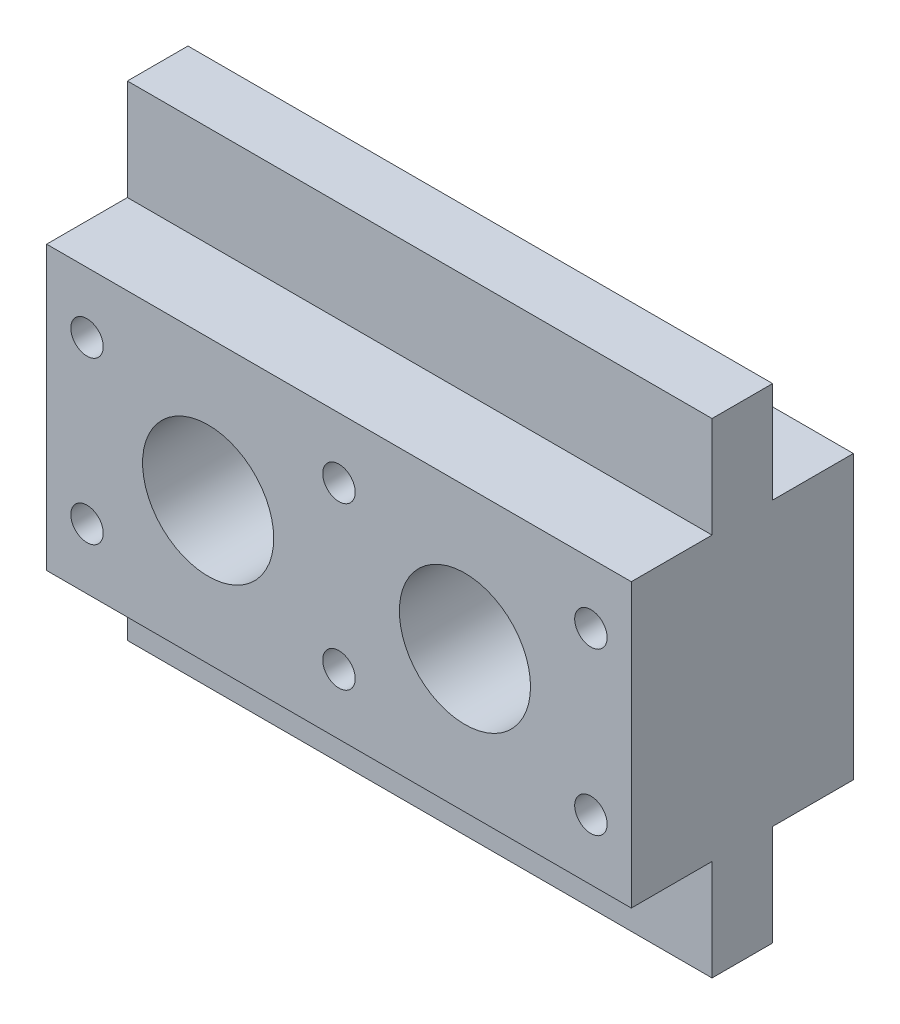
ISO-10303-21;
HEADER;
FILE_DESCRIPTION(('STEP AP214'),'2;1');
FILE_NAME('part.step','',(''),(''),'','','');
FILE_SCHEMA(('AUTOMOTIVE_DESIGN { 1 0 10303 214 1 1 1 1 }'));
ENDSEC;
DATA;
#1=APPLICATION_CONTEXT('core data for automotive mechanical design processes');
#2=APPLICATION_PROTOCOL_DEFINITION('international standard','automotive_design',2000,#1);
#3=PRODUCT_CONTEXT('',#1,'mechanical');
#4=PRODUCT('Part','Part','',(#3));
#5=PRODUCT_RELATED_PRODUCT_CATEGORY('part','',(#4));
#6=PRODUCT_DEFINITION_FORMATION('','',#4);
#7=PRODUCT_DEFINITION_CONTEXT('part definition',#1,'design');
#8=PRODUCT_DEFINITION('design','',#6,#7);
#9=PRODUCT_DEFINITION_SHAPE('','',#8);
#10=(LENGTH_UNIT() NAMED_UNIT(*) SI_UNIT(.MILLI.,.METRE.));
#11=(NAMED_UNIT(*) PLANE_ANGLE_UNIT() SI_UNIT($,.RADIAN.));
#12=(NAMED_UNIT(*) SI_UNIT($,.STERADIAN.) SOLID_ANGLE_UNIT());
#13=UNCERTAINTY_MEASURE_WITH_UNIT(LENGTH_MEASURE(1.E-05),#10,'distance_accuracy_value','');
#14=(GEOMETRIC_REPRESENTATION_CONTEXT(3) GLOBAL_UNCERTAINTY_ASSIGNED_CONTEXT((#13)) GLOBAL_UNIT_ASSIGNED_CONTEXT((#10,
#11,#12)) REPRESENTATION_CONTEXT('',''));
#15=CARTESIAN_POINT('',(0.,0.,0.));
#16=DIRECTION('',(0.,0.,1.));
#17=DIRECTION('',(1.,0.,0.));
#18=AXIS2_PLACEMENT_3D('',#15,#16,#17);
#19=CARTESIAN_POINT('',(0.,0.,4.7625));
#20=DIRECTION('',(0.,0.,-1.));
#21=DIRECTION('',(-1.,0.,0.));
#22=AXIS2_PLACEMENT_3D('',#19,#20,#21);
#23=PLANE('',#22);
#24=DIRECTION('',(0.,1.,0.));
#25=VECTOR('',#24,1.);
#26=CARTESIAN_POINT('',(91.948,0.,4.7625));
#27=LINE('',#26,#25);
#28=CARTESIAN_POINT('',(91.948,0.,4.7625));
#29=VERTEX_POINT('',#28);
#30=CARTESIAN_POINT('',(91.948,15.875,4.7625));
#31=VERTEX_POINT('',#30);
#32=EDGE_CURVE('E219',#29,#31,#27,.T.);
#33=ORIENTED_EDGE('',*,*,#32,.T.);
#34=DIRECTION('',(-1.,0.,0.));
#35=VECTOR('',#34,1.);
#36=CARTESIAN_POINT('',(0.,15.875,4.7625));
#37=LINE('',#36,#35);
#38=CARTESIAN_POINT('',(0.,15.875,4.7625));
#39=VERTEX_POINT('',#38);
#40=EDGE_CURVE('E190',#31,#39,#37,.T.);
#41=ORIENTED_EDGE('',*,*,#40,.T.);
#42=DIRECTION('',(0.,-1.,0.));
#43=VECTOR('',#42,1.);
#44=CARTESIAN_POINT('',(0.,0.,4.7625));
#45=LINE('',#44,#43);
#46=CARTESIAN_POINT('',(0.,0.,4.7625));
#47=VERTEX_POINT('',#46);
#48=EDGE_CURVE('E209',#39,#47,#45,.T.);
#49=ORIENTED_EDGE('',*,*,#48,.T.);
#50=DIRECTION('',(1.,0.,0.));
#51=VECTOR('',#50,1.);
#52=CARTESIAN_POINT('',(0.,0.,4.7625));
#53=LINE('',#52,#51);
#54=EDGE_CURVE('E216',#47,#29,#53,.T.);
#55=ORIENTED_EDGE('',*,*,#54,.T.);
#56=EDGE_LOOP('',(#33,#41,#49,#55));
#57=FACE_BOUND('',#56,.T.);
#58=ADVANCED_FACE('F48',(#57),#23,.F.);
#59=CARTESIAN_POINT('',(0.,0.,4.7625));
#60=DIRECTION('',(1.,0.,0.));
#61=DIRECTION('',(0.,0.,-1.));
#62=AXIS2_PLACEMENT_3D('',#59,#60,#61);
#63=PLANE('',#62);
#64=DIRECTION('',(0.,0.,-1.));
#65=VECTOR('',#64,1.);
#66=CARTESIAN_POINT('',(0.,76.2,4.7625));
#67=LINE('',#66,#65);
#68=CARTESIAN_POINT('',(0.,76.2,4.7625));
#69=VERTEX_POINT('',#68);
#70=CARTESIAN_POINT('',(0.,76.2,-4.7625));
#71=VERTEX_POINT('',#70);
#72=EDGE_CURVE('E223',#69,#71,#67,.T.);
#73=ORIENTED_EDGE('',*,*,#72,.T.);
#74=DIRECTION('',(0.,-1.,0.));
#75=VECTOR('',#74,1.);
#76=CARTESIAN_POINT('',(0.,0.,-4.7625));
#77=LINE('',#76,#75);
#78=CARTESIAN_POINT('',(0.,60.325,-4.7625));
#79=VERTEX_POINT('',#78);
#80=EDGE_CURVE('E178',#71,#79,#77,.T.);
#81=ORIENTED_EDGE('',*,*,#80,.T.);
#82=DIRECTION('',(0.,0.,1.));
#83=VECTOR('',#82,1.);
#84=CARTESIAN_POINT('',(0.,60.325,-17.4625));
#85=LINE('',#84,#83);
#86=CARTESIAN_POINT('',(0.,60.325,-17.4625));
#87=VERTEX_POINT('',#86);
#88=EDGE_CURVE('E158',#87,#79,#85,.T.);
#89=ORIENTED_EDGE('',*,*,#88,.F.);
#90=DIRECTION('',(0.,1.,0.));
#91=VECTOR('',#90,1.);
#92=CARTESIAN_POINT('',(0.,0.,-17.4625));
#93=LINE('',#92,#91);
#94=CARTESIAN_POINT('',(0.,15.875,-17.4625));
#95=VERTEX_POINT('',#94);
#96=EDGE_CURVE('E142',#95,#87,#93,.T.);
#97=ORIENTED_EDGE('',*,*,#96,.F.);
#98=DIRECTION('',(0.,0.,1.));
#99=VECTOR('',#98,1.);
#100=CARTESIAN_POINT('',(0.,15.875,-17.4625));
#101=LINE('',#100,#99);
#102=CARTESIAN_POINT('',(0.,15.875,-4.7625));
#103=VERTEX_POINT('',#102);
#104=EDGE_CURVE('E151',#95,#103,#101,.T.);
#105=ORIENTED_EDGE('',*,*,#104,.T.);
#106=CARTESIAN_POINT('',(0.,0.,-4.7625));
#107=VERTEX_POINT('',#106);
#108=EDGE_CURVE('E173',#103,#107,#77,.T.);
#109=ORIENTED_EDGE('',*,*,#108,.T.);
#110=DIRECTION('',(0.,0.,-1.));
#111=VECTOR('',#110,1.);
#112=CARTESIAN_POINT('',(0.,0.,4.7625));
#113=LINE('',#112,#111);
#114=EDGE_CURVE('E14',#47,#107,#113,.T.);
#115=ORIENTED_EDGE('',*,*,#114,.F.);
#116=ORIENTED_EDGE('',*,*,#48,.F.);
#117=DIRECTION('',(0.,0.,-1.));
#118=VECTOR('',#117,1.);
#119=CARTESIAN_POINT('',(0.,15.875,17.4625));
#120=LINE('',#119,#118);
#121=CARTESIAN_POINT('',(0.,15.875,17.4625));
#122=VERTEX_POINT('',#121);
#123=EDGE_CURVE('E203',#122,#39,#120,.T.);
#124=ORIENTED_EDGE('',*,*,#123,.F.);
#125=DIRECTION('',(0.,1.,0.));
#126=VECTOR('',#125,1.);
#127=CARTESIAN_POINT('',(0.,0.,17.4625));
#128=LINE('',#127,#126);
#129=CARTESIAN_POINT('',(0.,60.325,17.4625));
#130=VERTEX_POINT('',#129);
#131=EDGE_CURVE('E194',#122,#130,#128,.T.);
#132=ORIENTED_EDGE('',*,*,#131,.T.);
#133=DIRECTION('',(0.,0.,-1.));
#134=VECTOR('',#133,1.);
#135=CARTESIAN_POINT('',(0.,60.325,17.4625));
#136=LINE('',#135,#134);
#137=CARTESIAN_POINT('',(0.,60.325,4.7625));
#138=VERTEX_POINT('',#137);
#139=EDGE_CURVE('E211',#130,#138,#136,.T.);
#140=ORIENTED_EDGE('',*,*,#139,.T.);
#141=EDGE_CURVE('E214',#69,#138,#45,.T.);
#142=ORIENTED_EDGE('',*,*,#141,.F.);
#143=EDGE_LOOP('',(#73,#81,#89,#97,#105,#109,#115,#116,#124,#132,#140,#142));
#144=FACE_BOUND('',#143,.T.);
#145=ADVANCED_FACE('F50',(#144),#63,.F.);
#146=CARTESIAN_POINT('',(0.,0.,4.7625));
#147=DIRECTION('',(0.,1.,0.));
#148=DIRECTION('',(0.,0.,1.));
#149=AXIS2_PLACEMENT_3D('',#146,#147,#148);
#150=PLANE('',#149);
#151=ORIENTED_EDGE('',*,*,#114,.T.);
#152=DIRECTION('',(1.,0.,0.));
#153=VECTOR('',#152,1.);
#154=CARTESIAN_POINT('',(0.,0.,-4.7625));
#155=LINE('',#154,#153);
#156=CARTESIAN_POINT('',(91.948,0.,-4.7625));
#157=VERTEX_POINT('',#156);
#158=EDGE_CURVE('E180',#107,#157,#155,.T.);
#159=ORIENTED_EDGE('',*,*,#158,.T.);
#160=DIRECTION('',(0.,0.,-1.));
#161=VECTOR('',#160,1.);
#162=CARTESIAN_POINT('',(91.948,0.,4.7625));
#163=LINE('',#162,#161);
#164=EDGE_CURVE('E56',#29,#157,#163,.T.);
#165=ORIENTED_EDGE('',*,*,#164,.F.);
#166=ORIENTED_EDGE('',*,*,#54,.F.);
#167=EDGE_LOOP('',(#151,#159,#165,#166));
#168=FACE_BOUND('',#167,.T.);
#169=ADVANCED_FACE('F234',(#168),#150,.F.);
#170=CARTESIAN_POINT('',(91.948,0.,4.7625));
#171=DIRECTION('',(-1.,0.,0.));
#172=DIRECTION('',(0.,0.,1.));
#173=AXIS2_PLACEMENT_3D('',#170,#171,#172);
#174=PLANE('',#173);
#175=ORIENTED_EDGE('',*,*,#164,.T.);
#176=DIRECTION('',(0.,1.,0.));
#177=VECTOR('',#176,1.);
#178=CARTESIAN_POINT('',(91.948,0.,-4.7625));
#179=LINE('',#178,#177);
#180=CARTESIAN_POINT('',(91.948,15.875,-4.7625));
#181=VERTEX_POINT('',#180);
#182=EDGE_CURVE('E184',#157,#181,#179,.T.);
#183=ORIENTED_EDGE('',*,*,#182,.T.);
#184=DIRECTION('',(0.,0.,1.));
#185=VECTOR('',#184,1.);
#186=CARTESIAN_POINT('',(91.948,15.875,-17.4625));
#187=LINE('',#186,#185);
#188=CARTESIAN_POINT('',(91.948,15.875,-17.4625));
#189=VERTEX_POINT('',#188);
#190=EDGE_CURVE('E171',#189,#181,#187,.T.);
#191=ORIENTED_EDGE('',*,*,#190,.F.);
#192=DIRECTION('',(0.,-1.,0.));
#193=VECTOR('',#192,1.);
#194=CARTESIAN_POINT('',(91.948,0.,-17.4625));
#195=LINE('',#194,#193);
#196=CARTESIAN_POINT('',(91.948,60.325,-17.4625));
#197=VERTEX_POINT('',#196);
#198=EDGE_CURVE('E145',#197,#189,#195,.T.);
#199=ORIENTED_EDGE('',*,*,#198,.F.);
#200=DIRECTION('',(0.,0.,1.));
#201=VECTOR('',#200,1.);
#202=CARTESIAN_POINT('',(91.948,60.325,-17.4625));
#203=LINE('',#202,#201);
#204=CARTESIAN_POINT('',(91.948,60.325,-4.7625));
#205=VERTEX_POINT('',#204);
#206=EDGE_CURVE('E174',#197,#205,#203,.T.);
#207=ORIENTED_EDGE('',*,*,#206,.T.);
#208=CARTESIAN_POINT('',(91.948,76.2,-4.7625));
#209=VERTEX_POINT('',#208);
#210=EDGE_CURVE('E183',#205,#209,#179,.T.);
#211=ORIENTED_EDGE('',*,*,#210,.T.);
#212=DIRECTION('',(0.,0.,-1.));
#213=VECTOR('',#212,1.);
#214=CARTESIAN_POINT('',(91.948,76.2,4.7625));
#215=LINE('',#214,#213);
#216=CARTESIAN_POINT('',(91.948,76.2,4.7625));
#217=VERTEX_POINT('',#216);
#218=EDGE_CURVE('E225',#217,#209,#215,.T.);
#219=ORIENTED_EDGE('',*,*,#218,.F.);
#220=CARTESIAN_POINT('',(91.948,60.325,4.7625));
#221=VERTEX_POINT('',#220);
#222=EDGE_CURVE('E218',#221,#217,#27,.T.);
#223=ORIENTED_EDGE('',*,*,#222,.F.);
#224=DIRECTION('',(0.,0.,-1.));
#225=VECTOR('',#224,1.);
#226=CARTESIAN_POINT('',(91.948,60.325,17.4625));
#227=LINE('',#226,#225);
#228=CARTESIAN_POINT('',(91.948,60.325,17.4625));
#229=VERTEX_POINT('',#228);
#230=EDGE_CURVE('E63',#229,#221,#227,.T.);
#231=ORIENTED_EDGE('',*,*,#230,.F.);
#232=DIRECTION('',(0.,-1.,0.));
#233=VECTOR('',#232,1.);
#234=CARTESIAN_POINT('',(91.948,0.,17.4625));
#235=LINE('',#234,#233);
#236=CARTESIAN_POINT('',(91.948,15.875,17.4625));
#237=VERTEX_POINT('',#236);
#238=EDGE_CURVE('E200',#229,#237,#235,.T.);
#239=ORIENTED_EDGE('',*,*,#238,.T.);
#240=DIRECTION('',(0.,0.,-1.));
#241=VECTOR('',#240,1.);
#242=CARTESIAN_POINT('',(91.948,15.875,17.4625));
#243=LINE('',#242,#241);
#244=EDGE_CURVE('E207',#237,#31,#243,.T.);
#245=ORIENTED_EDGE('',*,*,#244,.T.);
#246=ORIENTED_EDGE('',*,*,#32,.F.);
#247=EDGE_LOOP('',(#175,#183,#191,#199,#207,#211,#219,#223,#231,#239,#245,#246));
#248=FACE_BOUND('',#247,.T.);
#249=ADVANCED_FACE('F229',(#248),#174,.F.);
#250=CARTESIAN_POINT('',(0.,76.2,4.7625));
#251=DIRECTION('',(0.,-1.,0.));
#252=DIRECTION('',(0.,0.,-1.));
#253=AXIS2_PLACEMENT_3D('',#250,#251,#252);
#254=PLANE('',#253);
#255=ORIENTED_EDGE('',*,*,#218,.T.);
#256=DIRECTION('',(-1.,0.,0.));
#257=VECTOR('',#256,1.);
#258=CARTESIAN_POINT('',(0.,76.2,-4.7625));
#259=LINE('',#258,#257);
#260=EDGE_CURVE('E187',#209,#71,#259,.T.);
#261=ORIENTED_EDGE('',*,*,#260,.T.);
#262=ORIENTED_EDGE('',*,*,#72,.F.);
#263=DIRECTION('',(-1.,0.,0.));
#264=VECTOR('',#263,1.);
#265=CARTESIAN_POINT('',(0.,76.2,4.7625));
#266=LINE('',#265,#264);
#267=EDGE_CURVE('E71',#217,#69,#266,.T.);
#268=ORIENTED_EDGE('',*,*,#267,.F.);
#269=EDGE_LOOP('',(#255,#261,#262,#268));
#270=FACE_BOUND('',#269,.T.);
#271=ADVANCED_FACE('F255',(#270),#254,.F.);
#272=ORIENTED_EDGE('',*,*,#141,.T.);
#273=DIRECTION('',(1.,0.,0.));
#274=VECTOR('',#273,1.);
#275=CARTESIAN_POINT('',(0.,60.325,4.7625));
#276=LINE('',#275,#274);
#277=EDGE_CURVE('E195',#138,#221,#276,.T.);
#278=ORIENTED_EDGE('',*,*,#277,.T.);
#279=ORIENTED_EDGE('',*,*,#222,.T.);
#280=ORIENTED_EDGE('',*,*,#267,.T.);
#281=EDGE_LOOP('',(#272,#278,#279,#280));
#282=FACE_BOUND('',#281,.T.);
#283=ADVANCED_FACE('F253',(#282),#23,.F.);
#284=CARTESIAN_POINT('',(0.,15.875,17.4625));
#285=DIRECTION('',(0.,-1.,0.));
#286=DIRECTION('',(1.,0.,0.));
#287=AXIS2_PLACEMENT_3D('',#284,#285,#286);
#288=PLANE('',#287);
#289=ORIENTED_EDGE('',*,*,#40,.F.);
#290=ORIENTED_EDGE('',*,*,#244,.F.);
#291=DIRECTION('',(-1.,0.,0.));
#292=VECTOR('',#291,1.);
#293=CARTESIAN_POINT('',(0.,15.875,17.4625));
#294=LINE('',#293,#292);
#295=EDGE_CURVE('E191',#237,#122,#294,.T.);
#296=ORIENTED_EDGE('',*,*,#295,.T.);
#297=ORIENTED_EDGE('',*,*,#123,.T.);
#298=EDGE_LOOP('',(#289,#290,#296,#297));
#299=FACE_BOUND('',#298,.T.);
#300=ADVANCED_FACE('F243',(#299),#288,.T.);
#301=CARTESIAN_POINT('',(0.,60.325,17.4625));
#302=DIRECTION('',(0.,1.,0.));
#303=DIRECTION('',(0.,0.,1.));
#304=AXIS2_PLACEMENT_3D('',#301,#302,#303);
#305=PLANE('',#304);
#306=ORIENTED_EDGE('',*,*,#277,.F.);
#307=ORIENTED_EDGE('',*,*,#139,.F.);
#308=DIRECTION('',(1.,0.,0.));
#309=VECTOR('',#308,1.);
#310=CARTESIAN_POINT('',(0.,60.325,17.4625));
#311=LINE('',#310,#309);
#312=EDGE_CURVE('E198',#130,#229,#311,.T.);
#313=ORIENTED_EDGE('',*,*,#312,.T.);
#314=ORIENTED_EDGE('',*,*,#230,.T.);
#315=EDGE_LOOP('',(#306,#307,#313,#314));
#316=FACE_BOUND('',#315,.T.);
#317=ADVANCED_FACE('F251',(#316),#305,.T.);
#318=CARTESIAN_POINT('',(0.,0.,17.4625));
#319=DIRECTION('',(0.,0.,-1.));
#320=DIRECTION('',(-1.,0.,0.));
#321=AXIS2_PLACEMENT_3D('',#318,#319,#320);
#322=PLANE('',#321);
#323=CARTESIAN_POINT('',(6.35,50.8,17.4625));
#324=DIRECTION('',(0.,0.,1.));
#325=DIRECTION('',(1.,0.,0.));
#326=AXIS2_PLACEMENT_3D('',#323,#324,#325);
#327=CIRCLE('',#326,2.5527);
#328=CARTESIAN_POINT('',(8.9027,50.8,17.4625));
#329=VERTEX_POINT('',#328);
#330=EDGE_CURVE('E519',#329,#329,#327,.T.);
#331=ORIENTED_EDGE('',*,*,#330,.F.);
#332=EDGE_LOOP('',(#331));
#333=FACE_BOUND('',#332,.T.);
#334=CARTESIAN_POINT('',(45.974,25.4,17.4625));
#335=DIRECTION('',(0.,0.,1.));
#336=DIRECTION('',(1.,0.,0.));
#337=AXIS2_PLACEMENT_3D('',#334,#335,#336);
#338=CIRCLE('',#337,2.5527);
#339=CARTESIAN_POINT('',(48.5267,25.4,17.4625));
#340=VERTEX_POINT('',#339);
#341=EDGE_CURVE('E520',#340,#340,#338,.T.);
#342=ORIENTED_EDGE('',*,*,#341,.F.);
#343=EDGE_LOOP('',(#342));
#344=FACE_BOUND('',#343,.T.);
#345=CARTESIAN_POINT('',(85.598,25.4,17.4625));
#346=DIRECTION('',(0.,0.,1.));
#347=DIRECTION('',(1.,0.,0.));
#348=AXIS2_PLACEMENT_3D('',#345,#346,#347);
#349=CIRCLE('',#348,2.55270000000001);
#350=CARTESIAN_POINT('',(88.1507,25.4,17.4625));
#351=VERTEX_POINT('',#350);
#352=EDGE_CURVE('E532',#351,#351,#349,.T.);
#353=ORIENTED_EDGE('',*,*,#352,.F.);
#354=EDGE_LOOP('',(#353));
#355=FACE_BOUND('',#354,.T.);
#356=CARTESIAN_POINT('',(85.598,50.8,17.4625));
#357=DIRECTION('',(0.,0.,1.));
#358=DIRECTION('',(1.,0.,0.));
#359=AXIS2_PLACEMENT_3D('',#356,#357,#358);
#360=CIRCLE('',#359,2.55270000000001);
#361=CARTESIAN_POINT('',(88.1507,50.8,17.4625));
#362=VERTEX_POINT('',#361);
#363=EDGE_CURVE('E538',#362,#362,#360,.T.);
#364=ORIENTED_EDGE('',*,*,#363,.F.);
#365=EDGE_LOOP('',(#364));
#366=FACE_BOUND('',#365,.T.);
#367=CARTESIAN_POINT('',(45.974,50.8,17.4625));
#368=DIRECTION('',(0.,0.,1.));
#369=DIRECTION('',(1.,0.,0.));
#370=AXIS2_PLACEMENT_3D('',#367,#368,#369);
#371=CIRCLE('',#370,2.5527);
#372=CARTESIAN_POINT('',(48.5267,50.8,17.4625));
#373=VERTEX_POINT('',#372);
#374=EDGE_CURVE('E544',#373,#373,#371,.T.);
#375=ORIENTED_EDGE('',*,*,#374,.F.);
#376=EDGE_LOOP('',(#375));
#377=FACE_BOUND('',#376,.T.);
#378=CARTESIAN_POINT('',(6.35,25.4,17.4625));
#379=DIRECTION('',(0.,0.,1.));
#380=DIRECTION('',(1.,0.,0.));
#381=AXIS2_PLACEMENT_3D('',#378,#379,#380);
#382=CIRCLE('',#381,2.5527);
#383=CARTESIAN_POINT('',(8.9027,25.4,17.4625));
#384=VERTEX_POINT('',#383);
#385=EDGE_CURVE('E523',#384,#384,#382,.T.);
#386=ORIENTED_EDGE('',*,*,#385,.F.);
#387=EDGE_LOOP('',(#386));
#388=FACE_BOUND('',#387,.T.);
#389=CARTESIAN_POINT('',(25.4,38.1,17.4625));
#390=DIRECTION('',(0.,0.,1.));
#391=DIRECTION('',(1.,0.,0.));
#392=AXIS2_PLACEMENT_3D('',#389,#390,#391);
#393=CIRCLE('',#392,10.3124);
#394=CARTESIAN_POINT('',(35.7124,38.1,17.4625));
#395=VERTEX_POINT('',#394);
#396=EDGE_CURVE('E553',#395,#395,#393,.T.);
#397=ORIENTED_EDGE('',*,*,#396,.F.);
#398=EDGE_LOOP('',(#397));
#399=FACE_BOUND('',#398,.T.);
#400=CARTESIAN_POINT('',(65.786,38.1,17.4625));
#401=DIRECTION('',(0.,0.,1.));
#402=DIRECTION('',(1.,0.,0.));
#403=AXIS2_PLACEMENT_3D('',#400,#401,#402);
#404=CIRCLE('',#403,10.3124);
#405=CARTESIAN_POINT('',(76.0984,38.1,17.4625));
#406=VERTEX_POINT('',#405);
#407=EDGE_CURVE('E556',#406,#406,#404,.T.);
#408=ORIENTED_EDGE('',*,*,#407,.F.);
#409=EDGE_LOOP('',(#408));
#410=FACE_BOUND('',#409,.T.);
#411=ORIENTED_EDGE('',*,*,#295,.F.);
#412=ORIENTED_EDGE('',*,*,#238,.F.);
#413=ORIENTED_EDGE('',*,*,#312,.F.);
#414=ORIENTED_EDGE('',*,*,#131,.F.);
#415=EDGE_LOOP('',(#411,#412,#413,#414));
#416=FACE_BOUND('',#415,.T.);
#417=ADVANCED_FACE('F247',(#333,#344,#355,#366,#377,#388,#399,#410,#416),#322,.F.);
#418=CARTESIAN_POINT('',(0.,0.,-4.7625));
#419=DIRECTION('',(0.,0.,1.));
#420=DIRECTION('',(-1.,0.,0.));
#421=AXIS2_PLACEMENT_3D('',#418,#419,#420);
#422=PLANE('',#421);
#423=ORIENTED_EDGE('',*,*,#182,.F.);
#424=ORIENTED_EDGE('',*,*,#158,.F.);
#425=ORIENTED_EDGE('',*,*,#108,.F.);
#426=DIRECTION('',(-1.,0.,0.));
#427=VECTOR('',#426,1.);
#428=CARTESIAN_POINT('',(0.,15.875,-4.7625));
#429=LINE('',#428,#427);
#430=EDGE_CURVE('E154',#181,#103,#429,.T.);
#431=ORIENTED_EDGE('',*,*,#430,.F.);
#432=EDGE_LOOP('',(#423,#424,#425,#431));
#433=FACE_BOUND('',#432,.T.);
#434=ADVANCED_FACE('F237',(#433),#422,.F.);
#435=ORIENTED_EDGE('',*,*,#80,.F.);
#436=ORIENTED_EDGE('',*,*,#260,.F.);
#437=ORIENTED_EDGE('',*,*,#210,.F.);
#438=DIRECTION('',(1.,0.,0.));
#439=VECTOR('',#438,1.);
#440=CARTESIAN_POINT('',(0.,60.325,-4.7625));
#441=LINE('',#440,#439);
#442=EDGE_CURVE('E148',#79,#205,#441,.T.);
#443=ORIENTED_EDGE('',*,*,#442,.F.);
#444=EDGE_LOOP('',(#435,#436,#437,#443));
#445=FACE_BOUND('',#444,.T.);
#446=ADVANCED_FACE('F292',(#445),#422,.F.);
#447=CARTESIAN_POINT('',(0.,15.875,-17.4625));
#448=DIRECTION('',(0.,-1.,0.));
#449=DIRECTION('',(1.,0.,0.));
#450=AXIS2_PLACEMENT_3D('',#447,#448,#449);
#451=PLANE('',#450);
#452=ORIENTED_EDGE('',*,*,#430,.T.);
#453=ORIENTED_EDGE('',*,*,#104,.F.);
#454=DIRECTION('',(-1.,0.,0.));
#455=VECTOR('',#454,1.);
#456=CARTESIAN_POINT('',(0.,15.875,-17.4625));
#457=LINE('',#456,#455);
#458=EDGE_CURVE('E138',#189,#95,#457,.T.);
#459=ORIENTED_EDGE('',*,*,#458,.F.);
#460=ORIENTED_EDGE('',*,*,#190,.T.);
#461=EDGE_LOOP('',(#452,#453,#459,#460));
#462=FACE_BOUND('',#461,.T.);
#463=ADVANCED_FACE('F152',(#462),#451,.T.);
#464=CARTESIAN_POINT('',(0.,60.325,-17.4625));
#465=DIRECTION('',(0.,1.,0.));
#466=DIRECTION('',(0.,0.,-1.));
#467=AXIS2_PLACEMENT_3D('',#464,#465,#466);
#468=PLANE('',#467);
#469=ORIENTED_EDGE('',*,*,#442,.T.);
#470=ORIENTED_EDGE('',*,*,#206,.F.);
#471=DIRECTION('',(1.,0.,0.));
#472=VECTOR('',#471,1.);
#473=CARTESIAN_POINT('',(0.,60.325,-17.4625));
#474=LINE('',#473,#472);
#475=EDGE_CURVE('E162',#87,#197,#474,.T.);
#476=ORIENTED_EDGE('',*,*,#475,.F.);
#477=ORIENTED_EDGE('',*,*,#88,.T.);
#478=EDGE_LOOP('',(#469,#470,#476,#477));
#479=FACE_BOUND('',#478,.T.);
#480=ADVANCED_FACE('F311',(#479),#468,.T.);
#481=CARTESIAN_POINT('',(0.,0.,-17.4625));
#482=DIRECTION('',(0.,0.,1.));
#483=DIRECTION('',(-1.,0.,0.));
#484=AXIS2_PLACEMENT_3D('',#481,#482,#483);
#485=PLANE('',#484);
#486=CARTESIAN_POINT('',(25.4,38.1,-17.4625));
#487=DIRECTION('',(0.,0.,1.));
#488=DIRECTION('',(1.,0.,0.));
#489=AXIS2_PLACEMENT_3D('',#486,#487,#488);
#490=CIRCLE('',#489,10.3124);
#491=CARTESIAN_POINT('',(35.7124,38.1,-17.4625));
#492=VERTEX_POINT('',#491);
#493=EDGE_CURVE('E169',#492,#492,#490,.T.);
#494=ORIENTED_EDGE('',*,*,#493,.T.);
#495=EDGE_LOOP('',(#494));
#496=FACE_BOUND('',#495,.T.);
#497=CARTESIAN_POINT('',(65.786,38.1,-17.4625));
#498=DIRECTION('',(0.,0.,1.));
#499=DIRECTION('',(1.,0.,0.));
#500=AXIS2_PLACEMENT_3D('',#497,#498,#499);
#501=CIRCLE('',#500,10.3124);
#502=CARTESIAN_POINT('',(76.0984,38.1,-17.4625));
#503=VERTEX_POINT('',#502);
#504=EDGE_CURVE('E548',#503,#503,#501,.T.);
#505=ORIENTED_EDGE('',*,*,#504,.T.);
#506=EDGE_LOOP('',(#505));
#507=FACE_BOUND('',#506,.T.);
#508=ORIENTED_EDGE('',*,*,#458,.T.);
#509=ORIENTED_EDGE('',*,*,#96,.T.);
#510=ORIENTED_EDGE('',*,*,#475,.T.);
#511=ORIENTED_EDGE('',*,*,#198,.T.);
#512=EDGE_LOOP('',(#508,#509,#510,#511));
#513=FACE_BOUND('',#512,.T.);
#514=ADVANCED_FACE('F140',(#496,#507,#513),#485,.F.);
#515=CARTESIAN_POINT('',(65.786,38.1,-17.4625));
#516=DIRECTION('',(0.,0.,1.));
#517=DIRECTION('',(1.,0.,0.));
#518=AXIS2_PLACEMENT_3D('',#515,#516,#517);
#519=CYLINDRICAL_SURFACE('',#518,10.3124);
#520=ORIENTED_EDGE('',*,*,#504,.F.);
#521=EDGE_LOOP('',(#520));
#522=FACE_BOUND('',#521,.T.);
#523=ORIENTED_EDGE('',*,*,#407,.T.);
#524=EDGE_LOOP('',(#523));
#525=FACE_BOUND('',#524,.T.);
#526=ADVANCED_FACE('F329',(#522,#525),#519,.F.);
#527=CARTESIAN_POINT('',(25.4,38.1,-17.4625));
#528=DIRECTION('',(0.,0.,1.));
#529=DIRECTION('',(1.,0.,0.));
#530=AXIS2_PLACEMENT_3D('',#527,#528,#529);
#531=CYLINDRICAL_SURFACE('',#530,10.3124);
#532=ORIENTED_EDGE('',*,*,#493,.F.);
#533=EDGE_LOOP('',(#532));
#534=FACE_BOUND('',#533,.T.);
#535=ORIENTED_EDGE('',*,*,#396,.T.);
#536=EDGE_LOOP('',(#535));
#537=FACE_BOUND('',#536,.T.);
#538=ADVANCED_FACE('F339',(#534,#537),#531,.F.);
#539=CARTESIAN_POINT('',(6.35,25.4,4.7625));
#540=DIRECTION('',(0.,0.,1.));
#541=DIRECTION('',(1.,0.,0.));
#542=AXIS2_PLACEMENT_3D('',#539,#540,#541);
#543=CYLINDRICAL_SURFACE('',#542,2.5527);
#544=CARTESIAN_POINT('',(6.35,25.4,4.7625));
#545=DIRECTION('',(0.,0.,1.));
#546=DIRECTION('',(1.,0.,0.));
#547=AXIS2_PLACEMENT_3D('',#544,#545,#546);
#548=CIRCLE('',#547,2.5527);
#549=CARTESIAN_POINT('',(8.9027,25.4,4.7625));
#550=VERTEX_POINT('',#549);
#551=EDGE_CURVE('E545',#550,#550,#548,.T.);
#552=ORIENTED_EDGE('',*,*,#551,.F.);
#553=EDGE_LOOP('',(#552));
#554=FACE_BOUND('',#553,.T.);
#555=ORIENTED_EDGE('',*,*,#385,.T.);
#556=EDGE_LOOP('',(#555));
#557=FACE_BOUND('',#556,.T.);
#558=ADVANCED_FACE('F349',(#554,#557),#543,.F.);
#559=CARTESIAN_POINT('',(6.35,25.4,4.7625));
#560=DIRECTION('',(0.,0.,1.));
#561=DIRECTION('',(1.,0.,0.));
#562=AXIS2_PLACEMENT_3D('',#559,#560,#561);
#563=PLANE('',#562);
#564=ORIENTED_EDGE('',*,*,#551,.T.);
#565=EDGE_LOOP('',(#564));
#566=FACE_BOUND('',#565,.T.);
#567=ADVANCED_FACE('F368',(#566),#563,.T.);
#568=CARTESIAN_POINT('',(45.974,50.8,4.7625));
#569=DIRECTION('',(0.,0.,1.));
#570=DIRECTION('',(1.,0.,0.));
#571=AXIS2_PLACEMENT_3D('',#568,#569,#570);
#572=CYLINDRICAL_SURFACE('',#571,2.5527);
#573=CARTESIAN_POINT('',(45.974,50.8,4.7625));
#574=DIRECTION('',(0.,0.,1.));
#575=DIRECTION('',(1.,0.,0.));
#576=AXIS2_PLACEMENT_3D('',#573,#574,#575);
#577=CIRCLE('',#576,2.5527);
#578=CARTESIAN_POINT('',(48.5267,50.8,4.7625));
#579=VERTEX_POINT('',#578);
#580=EDGE_CURVE('E574',#579,#579,#577,.T.);
#581=ORIENTED_EDGE('',*,*,#580,.F.);
#582=EDGE_LOOP('',(#581));
#583=FACE_BOUND('',#582,.T.);
#584=ORIENTED_EDGE('',*,*,#374,.T.);
#585=EDGE_LOOP('',(#584));
#586=FACE_BOUND('',#585,.T.);
#587=ADVANCED_FACE('F378',(#583,#586),#572,.F.);
#588=CARTESIAN_POINT('',(45.974,50.8,4.7625));
#589=DIRECTION('',(0.,0.,1.));
#590=DIRECTION('',(1.,0.,0.));
#591=AXIS2_PLACEMENT_3D('',#588,#589,#590);
#592=PLANE('',#591);
#593=ORIENTED_EDGE('',*,*,#580,.T.);
#594=EDGE_LOOP('',(#593));
#595=FACE_BOUND('',#594,.T.);
#596=ADVANCED_FACE('F388',(#595),#592,.T.);
#597=CARTESIAN_POINT('',(85.598,50.8,4.7625));
#598=DIRECTION('',(0.,0.,1.));
#599=DIRECTION('',(1.,0.,0.));
#600=AXIS2_PLACEMENT_3D('',#597,#598,#599);
#601=CYLINDRICAL_SURFACE('',#600,2.55270000000001);
#602=CARTESIAN_POINT('',(85.598,50.8,4.7625));
#603=DIRECTION('',(0.,0.,1.));
#604=DIRECTION('',(1.,0.,0.));
#605=AXIS2_PLACEMENT_3D('',#602,#603,#604);
#606=CIRCLE('',#605,2.55270000000001);
#607=CARTESIAN_POINT('',(88.1507,50.8,4.7625));
#608=VERTEX_POINT('',#607);
#609=EDGE_CURVE('E541',#608,#608,#606,.T.);
#610=ORIENTED_EDGE('',*,*,#609,.F.);
#611=EDGE_LOOP('',(#610));
#612=FACE_BOUND('',#611,.T.);
#613=ORIENTED_EDGE('',*,*,#363,.T.);
#614=EDGE_LOOP('',(#613));
#615=FACE_BOUND('',#614,.T.);
#616=ADVANCED_FACE('F398',(#612,#615),#601,.F.);
#617=CARTESIAN_POINT('',(85.598,50.8,4.7625));
#618=DIRECTION('',(0.,0.,1.));
#619=DIRECTION('',(1.,0.,0.));
#620=AXIS2_PLACEMENT_3D('',#617,#618,#619);
#621=PLANE('',#620);
#622=ORIENTED_EDGE('',*,*,#609,.T.);
#623=EDGE_LOOP('',(#622));
#624=FACE_BOUND('',#623,.T.);
#625=ADVANCED_FACE('F408',(#624),#621,.T.);
#626=CARTESIAN_POINT('',(85.598,25.4,4.7625));
#627=DIRECTION('',(0.,0.,1.));
#628=DIRECTION('',(1.,0.,0.));
#629=AXIS2_PLACEMENT_3D('',#626,#627,#628);
#630=CYLINDRICAL_SURFACE('',#629,2.55270000000001);
#631=CARTESIAN_POINT('',(85.598,25.4,4.7625));
#632=DIRECTION('',(0.,0.,1.));
#633=DIRECTION('',(1.,0.,0.));
#634=AXIS2_PLACEMENT_3D('',#631,#632,#633);
#635=CIRCLE('',#634,2.55270000000001);
#636=CARTESIAN_POINT('',(88.1507,25.4,4.7625));
#637=VERTEX_POINT('',#636);
#638=EDGE_CURVE('E535',#637,#637,#635,.T.);
#639=ORIENTED_EDGE('',*,*,#638,.F.);
#640=EDGE_LOOP('',(#639));
#641=FACE_BOUND('',#640,.T.);
#642=ORIENTED_EDGE('',*,*,#352,.T.);
#643=EDGE_LOOP('',(#642));
#644=FACE_BOUND('',#643,.T.);
#645=ADVANCED_FACE('F418',(#641,#644),#630,.F.);
#646=CARTESIAN_POINT('',(85.598,25.4,4.7625));
#647=DIRECTION('',(0.,0.,1.));
#648=DIRECTION('',(1.,0.,0.));
#649=AXIS2_PLACEMENT_3D('',#646,#647,#648);
#650=PLANE('',#649);
#651=ORIENTED_EDGE('',*,*,#638,.T.);
#652=EDGE_LOOP('',(#651));
#653=FACE_BOUND('',#652,.T.);
#654=ADVANCED_FACE('F428',(#653),#650,.T.);
#655=CARTESIAN_POINT('',(45.974,25.4,4.7625));
#656=DIRECTION('',(0.,0.,1.));
#657=DIRECTION('',(1.,0.,0.));
#658=AXIS2_PLACEMENT_3D('',#655,#656,#657);
#659=CYLINDRICAL_SURFACE('',#658,2.5527);
#660=CARTESIAN_POINT('',(45.974,25.4,4.7625));
#661=DIRECTION('',(0.,0.,1.));
#662=DIRECTION('',(1.,0.,0.));
#663=AXIS2_PLACEMENT_3D('',#660,#661,#662);
#664=CIRCLE('',#663,2.5527);
#665=CARTESIAN_POINT('',(48.5267,25.4,4.7625));
#666=VERTEX_POINT('',#665);
#667=EDGE_CURVE('E526',#666,#666,#664,.T.);
#668=ORIENTED_EDGE('',*,*,#667,.F.);
#669=EDGE_LOOP('',(#668));
#670=FACE_BOUND('',#669,.T.);
#671=ORIENTED_EDGE('',*,*,#341,.T.);
#672=EDGE_LOOP('',(#671));
#673=FACE_BOUND('',#672,.T.);
#674=ADVANCED_FACE('F438',(#670,#673),#659,.F.);
#675=CARTESIAN_POINT('',(45.974,25.4,4.7625));
#676=DIRECTION('',(0.,0.,1.));
#677=DIRECTION('',(1.,0.,0.));
#678=AXIS2_PLACEMENT_3D('',#675,#676,#677);
#679=PLANE('',#678);
#680=ORIENTED_EDGE('',*,*,#667,.T.);
#681=EDGE_LOOP('',(#680));
#682=FACE_BOUND('',#681,.T.);
#683=ADVANCED_FACE('F448',(#682),#679,.T.);
#684=CARTESIAN_POINT('',(6.35,50.8,4.7625));
#685=DIRECTION('',(0.,0.,1.));
#686=DIRECTION('',(1.,0.,0.));
#687=AXIS2_PLACEMENT_3D('',#684,#685,#686);
#688=CYLINDRICAL_SURFACE('',#687,2.5527);
#689=CARTESIAN_POINT('',(6.35,50.8,4.7625));
#690=DIRECTION('',(0.,0.,1.));
#691=DIRECTION('',(1.,0.,0.));
#692=AXIS2_PLACEMENT_3D('',#689,#690,#691);
#693=CIRCLE('',#692,2.5527);
#694=CARTESIAN_POINT('',(8.9027,50.8,4.7625));
#695=VERTEX_POINT('',#694);
#696=EDGE_CURVE('E518',#695,#695,#693,.T.);
#697=ORIENTED_EDGE('',*,*,#696,.F.);
#698=EDGE_LOOP('',(#697));
#699=FACE_BOUND('',#698,.T.);
#700=ORIENTED_EDGE('',*,*,#330,.T.);
#701=EDGE_LOOP('',(#700));
#702=FACE_BOUND('',#701,.T.);
#703=ADVANCED_FACE('F458',(#699,#702),#688,.F.);
#704=CARTESIAN_POINT('',(6.35,50.8,4.7625));
#705=DIRECTION('',(0.,0.,1.));
#706=DIRECTION('',(1.,0.,0.));
#707=AXIS2_PLACEMENT_3D('',#704,#705,#706);
#708=PLANE('',#707);
#709=ORIENTED_EDGE('',*,*,#696,.T.);
#710=EDGE_LOOP('',(#709));
#711=FACE_BOUND('',#710,.T.);
#712=ADVANCED_FACE('F468',(#711),#708,.T.);
#713=CLOSED_SHELL('',(#58,#145,#169,#249,#271,#283,#300,#317,#417,#434,#446,#463,#480,#514,#526,
#538,#558,#567,#587,#596,#616,#625,#645,#654,#674,#683,#703,#712));
#714=MANIFOLD_SOLID_BREP('B2',#713);
#715=ADVANCED_BREP_SHAPE_REPRESENTATION('',(#18,#714),#14);
#716=SHAPE_DEFINITION_REPRESENTATION(#9,#715);
ENDSEC;
END-ISO-10303-21;
